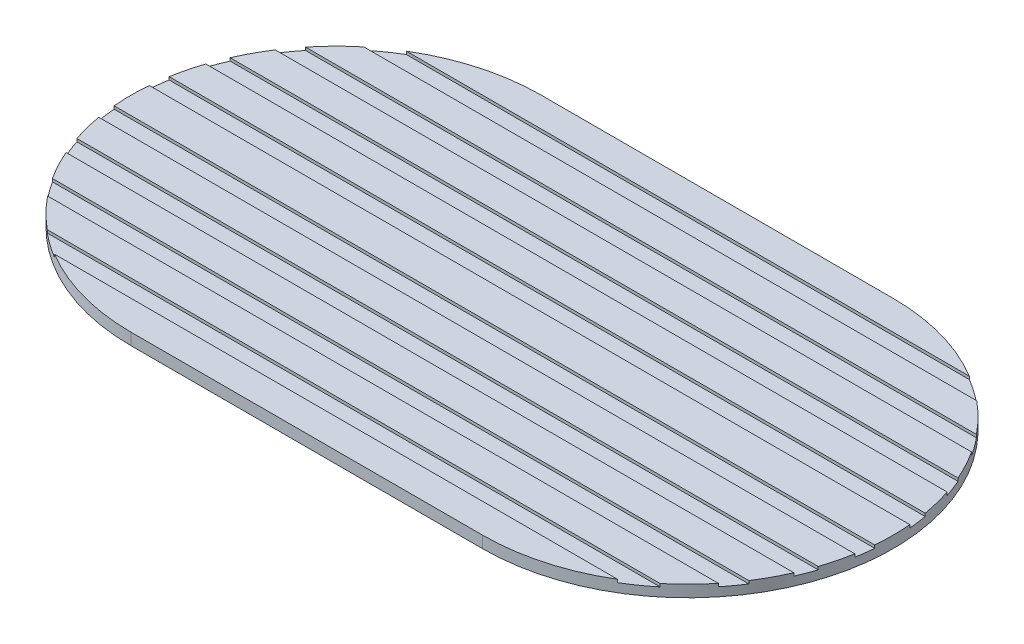
ISO-10303-21;
HEADER;
FILE_DESCRIPTION(('STEP AP214'),'2;1');
FILE_NAME('part.step','',(''),(''),'','','');
FILE_SCHEMA(('AUTOMOTIVE_DESIGN { 1 0 10303 214 1 1 1 1 }'));
ENDSEC;
DATA;
#1=APPLICATION_CONTEXT('core data for automotive mechanical design processes');
#2=APPLICATION_PROTOCOL_DEFINITION('international standard','automotive_design',2000,#1);
#3=PRODUCT_CONTEXT('',#1,'mechanical');
#4=PRODUCT('Part','Part','',(#3));
#5=PRODUCT_RELATED_PRODUCT_CATEGORY('part','',(#4));
#6=PRODUCT_DEFINITION_FORMATION('','',#4);
#7=PRODUCT_DEFINITION_CONTEXT('part definition',#1,'design');
#8=PRODUCT_DEFINITION('design','',#6,#7);
#9=PRODUCT_DEFINITION_SHAPE('','',#8);
#10=(LENGTH_UNIT() NAMED_UNIT(*) SI_UNIT(.MILLI.,.METRE.));
#11=(NAMED_UNIT(*) PLANE_ANGLE_UNIT() SI_UNIT($,.RADIAN.));
#12=(NAMED_UNIT(*) SI_UNIT($,.STERADIAN.) SOLID_ANGLE_UNIT());
#13=UNCERTAINTY_MEASURE_WITH_UNIT(LENGTH_MEASURE(1.E-05),#10,'distance_accuracy_value','');
#14=(GEOMETRIC_REPRESENTATION_CONTEXT(3) GLOBAL_UNCERTAINTY_ASSIGNED_CONTEXT((#13)) GLOBAL_UNIT_ASSIGNED_CONTEXT((#10,
#11,#12)) REPRESENTATION_CONTEXT('',''));
#15=CARTESIAN_POINT('',(0.,0.,0.));
#16=DIRECTION('',(0.,0.,1.));
#17=DIRECTION('',(1.,0.,0.));
#18=AXIS2_PLACEMENT_3D('',#15,#16,#17);
#19=CARTESIAN_POINT('',(0.,2.,0.));
#20=DIRECTION('',(0.,1.,0.));
#21=DIRECTION('',(0.,0.,1.));
#22=AXIS2_PLACEMENT_3D('',#19,#20,#21);
#23=PLANE('',#22);
#24=DIRECTION('',(-1.,0.,0.));
#25=VECTOR('',#24,1.);
#26=CARTESIAN_POINT('',(0.,2.,-30.));
#27=LINE('',#26,#25);
#28=CARTESIAN_POINT('',(18.0277563773199,2.,-30.));
#29=VERTEX_POINT('',#28);
#30=CARTESIAN_POINT('',(-78.02775637732,2.,-30.));
#31=VERTEX_POINT('',#30);
#32=EDGE_CURVE('E353',#29,#31,#27,.T.);
#33=ORIENTED_EDGE('',*,*,#32,.F.);
#34=CARTESIAN_POINT('',(0.,2.,0.));
#35=DIRECTION('',(0.,1.,0.));
#36=DIRECTION('',(0.,0.,1.));
#37=AXIS2_PLACEMENT_3D('',#34,#35,#36);
#38=CIRCLE('',#37,35.);
#39=CARTESIAN_POINT('',(0.,2.,-35.));
#40=VERTEX_POINT('',#39);
#41=EDGE_CURVE('E295',#29,#40,#38,.T.);
#42=ORIENTED_EDGE('',*,*,#41,.T.);
#43=DIRECTION('',(-1.,0.,0.));
#44=VECTOR('',#43,1.);
#45=CARTESIAN_POINT('',(0.,2.,-35.));
#46=LINE('',#45,#44);
#47=CARTESIAN_POINT('',(-60.,2.,-35.));
#48=VERTEX_POINT('',#47);
#49=EDGE_CURVE('E292',#40,#48,#46,.T.);
#50=ORIENTED_EDGE('',*,*,#49,.T.);
#51=CARTESIAN_POINT('',(-60.,2.,0.));
#52=DIRECTION('',(0.,1.,0.));
#53=DIRECTION('',(0.,0.,1.));
#54=AXIS2_PLACEMENT_3D('',#51,#52,#53);
#55=CIRCLE('',#54,35.);
#56=EDGE_CURVE('E444',#48,#31,#55,.T.);
#57=ORIENTED_EDGE('',*,*,#56,.T.);
#58=EDGE_LOOP('',(#33,#42,#50,#57));
#59=FACE_BOUND('',#58,.T.);
#60=ADVANCED_FACE('F35',(#59),#23,.T.);
#61=DIRECTION('',(-1.,0.,0.));
#62=VECTOR('',#61,1.);
#63=CARTESIAN_POINT('',(0.,2.,-14.));
#64=LINE('',#63,#62);
#65=CARTESIAN_POINT('',(32.0780298646909,2.,-14.));
#66=VERTEX_POINT('',#65);
#67=CARTESIAN_POINT('',(-92.0780298646909,2.,-14.));
#68=VERTEX_POINT('',#67);
#69=EDGE_CURVE('E349',#66,#68,#64,.T.);
#70=ORIENTED_EDGE('',*,*,#69,.F.);
#71=CARTESIAN_POINT('',(29.3938769133981,2.,-19.));
#72=VERTEX_POINT('',#71);
#73=EDGE_CURVE('E307',#66,#72,#38,.T.);
#74=ORIENTED_EDGE('',*,*,#73,.T.);
#75=DIRECTION('',(1.,0.,0.));
#76=VECTOR('',#75,1.);
#77=CARTESIAN_POINT('',(0.,2.,-19.));
#78=LINE('',#77,#76);
#79=CARTESIAN_POINT('',(-89.3938769133981,2.,-19.));
#80=VERTEX_POINT('',#79);
#81=EDGE_CURVE('E343',#80,#72,#78,.T.);
#82=ORIENTED_EDGE('',*,*,#81,.F.);
#83=EDGE_CURVE('E449',#80,#68,#55,.T.);
#84=ORIENTED_EDGE('',*,*,#83,.T.);
#85=EDGE_LOOP('',(#70,#74,#82,#84));
#86=FACE_BOUND('',#85,.T.);
#87=ADVANCED_FACE('F481',(#86),#23,.T.);
#88=DIRECTION('',(1.,0.,0.));
#89=VECTOR('',#88,1.);
#90=CARTESIAN_POINT('',(0.,2.,-27.));
#91=LINE('',#90,#89);
#92=CARTESIAN_POINT('',(-82.2710574513201,2.,-27.));
#93=VERTEX_POINT('',#92);
#94=CARTESIAN_POINT('',(22.2710574513201,2.,-27.));
#95=VERTEX_POINT('',#94);
#96=EDGE_CURVE('E351',#93,#95,#91,.T.);
#97=ORIENTED_EDGE('',*,*,#96,.F.);
#98=CARTESIAN_POINT('',(-87.2213151776324,2.,-22.));
#99=VERTEX_POINT('',#98);
#100=EDGE_CURVE('E446',#93,#99,#55,.T.);
#101=ORIENTED_EDGE('',*,*,#100,.T.);
#102=DIRECTION('',(-1.,0.,0.));
#103=VECTOR('',#102,1.);
#104=CARTESIAN_POINT('',(0.,2.,-22.));
#105=LINE('',#104,#103);
#106=CARTESIAN_POINT('',(27.2213151776324,2.,-22.));
#107=VERTEX_POINT('',#106);
#108=EDGE_CURVE('E345',#107,#99,#105,.T.);
#109=ORIENTED_EDGE('',*,*,#108,.F.);
#110=EDGE_CURVE('E301',#107,#95,#38,.T.);
#111=ORIENTED_EDGE('',*,*,#110,.T.);
#112=EDGE_LOOP('',(#97,#101,#109,#111));
#113=FACE_BOUND('',#112,.T.);
#114=ADVANCED_FACE('F555',(#113),#23,.T.);
#115=DIRECTION('',(1.,0.,0.));
#116=VECTOR('',#115,1.);
#117=CARTESIAN_POINT('',(0.,2.,-11.));
#118=LINE('',#117,#116);
#119=CARTESIAN_POINT('',(-93.2264954516723,2.,-11.));
#120=VERTEX_POINT('',#119);
#121=CARTESIAN_POINT('',(33.2264954516723,2.,-11.));
#122=VERTEX_POINT('',#121);
#123=EDGE_CURVE('E347',#120,#122,#118,.T.);
#124=ORIENTED_EDGE('',*,*,#123,.F.);
#125=CARTESIAN_POINT('',(-94.4818792991334,2.,-6.));
#126=VERTEX_POINT('',#125);
#127=EDGE_CURVE('E394',#120,#126,#55,.T.);
#128=ORIENTED_EDGE('',*,*,#127,.T.);
#129=DIRECTION('',(-1.,0.,0.));
#130=VECTOR('',#129,1.);
#131=CARTESIAN_POINT('',(0.,2.,-6.));
#132=LINE('',#131,#130);
#133=CARTESIAN_POINT('',(34.4818792991333,2.,-6.));
#134=VERTEX_POINT('',#133);
#135=EDGE_CURVE('E341',#134,#126,#132,.T.);
#136=ORIENTED_EDGE('',*,*,#135,.F.);
#137=EDGE_CURVE('E492',#134,#122,#38,.T.);
#138=ORIENTED_EDGE('',*,*,#137,.T.);
#139=EDGE_LOOP('',(#124,#128,#136,#138));
#140=FACE_BOUND('',#139,.T.);
#141=ADVANCED_FACE('F663',(#140),#23,.T.);
#142=DIRECTION('',(1.,0.,0.));
#143=VECTOR('',#142,1.);
#144=CARTESIAN_POINT('',(0.,2.,-3.));
#145=LINE('',#144,#143);
#146=CARTESIAN_POINT('',(-94.8711915483254,2.,-3.));
#147=VERTEX_POINT('',#146);
#148=CARTESIAN_POINT('',(34.8711915483254,2.,-3.));
#149=VERTEX_POINT('',#148);
#150=EDGE_CURVE('E339',#147,#149,#145,.T.);
#151=ORIENTED_EDGE('',*,*,#150,.F.);
#152=CARTESIAN_POINT('',(-94.8711915483254,2.,3.));
#153=VERTEX_POINT('',#152);
#154=EDGE_CURVE('E464',#147,#153,#55,.T.);
#155=ORIENTED_EDGE('',*,*,#154,.T.);
#156=DIRECTION('',(-1.,0.,0.));
#157=VECTOR('',#156,1.);
#158=CARTESIAN_POINT('',(0.,2.,3.));
#159=LINE('',#158,#157);
#160=CARTESIAN_POINT('',(34.8711915483254,2.,3.));
#161=VERTEX_POINT('',#160);
#162=EDGE_CURVE('E337',#161,#153,#159,.T.);
#163=ORIENTED_EDGE('',*,*,#162,.F.);
#164=EDGE_CURVE('E494',#161,#149,#38,.T.);
#165=ORIENTED_EDGE('',*,*,#164,.T.);
#166=EDGE_LOOP('',(#151,#155,#163,#165));
#167=FACE_BOUND('',#166,.T.);
#168=ADVANCED_FACE('F659',(#167),#23,.T.);
#169=DIRECTION('',(1.,0.,0.));
#170=VECTOR('',#169,1.);
#171=CARTESIAN_POINT('',(0.,2.,6.));
#172=LINE('',#171,#170);
#173=CARTESIAN_POINT('',(-94.4818792991334,2.,6.));
#174=VERTEX_POINT('',#173);
#175=CARTESIAN_POINT('',(34.4818792991333,2.,6.));
#176=VERTEX_POINT('',#175);
#177=EDGE_CURVE('E335',#174,#176,#172,.T.);
#178=ORIENTED_EDGE('',*,*,#177,.F.);
#179=CARTESIAN_POINT('',(-93.2264954516723,2.,11.));
#180=VERTEX_POINT('',#179);
#181=EDGE_CURVE('E458',#174,#180,#55,.T.);
#182=ORIENTED_EDGE('',*,*,#181,.T.);
#183=DIRECTION('',(-1.,0.,0.));
#184=VECTOR('',#183,1.);
#185=CARTESIAN_POINT('',(0.,2.,11.));
#186=LINE('',#185,#184);
#187=CARTESIAN_POINT('',(33.2264954516723,2.,11.));
#188=VERTEX_POINT('',#187);
#189=EDGE_CURVE('E333',#188,#180,#186,.T.);
#190=ORIENTED_EDGE('',*,*,#189,.F.);
#191=EDGE_CURVE('E497',#188,#176,#38,.T.);
#192=ORIENTED_EDGE('',*,*,#191,.T.);
#193=EDGE_LOOP('',(#178,#182,#190,#192));
#194=FACE_BOUND('',#193,.T.);
#195=ADVANCED_FACE('F655',(#194),#23,.T.);
#196=DIRECTION('',(1.,0.,0.));
#197=VECTOR('',#196,1.);
#198=CARTESIAN_POINT('',(0.,2.,14.));
#199=LINE('',#198,#197);
#200=CARTESIAN_POINT('',(-92.0780298646909,2.,14.));
#201=VERTEX_POINT('',#200);
#202=CARTESIAN_POINT('',(32.0780298646909,2.,14.));
#203=VERTEX_POINT('',#202);
#204=EDGE_CURVE('E331',#201,#203,#199,.T.);
#205=ORIENTED_EDGE('',*,*,#204,.F.);
#206=CARTESIAN_POINT('',(-89.3938769133981,2.,19.));
#207=VERTEX_POINT('',#206);
#208=EDGE_CURVE('E453',#201,#207,#55,.T.);
#209=ORIENTED_EDGE('',*,*,#208,.T.);
#210=DIRECTION('',(-1.,0.,0.));
#211=VECTOR('',#210,1.);
#212=CARTESIAN_POINT('',(0.,2.,19.));
#213=LINE('',#212,#211);
#214=CARTESIAN_POINT('',(29.3938769133981,2.,19.));
#215=VERTEX_POINT('',#214);
#216=EDGE_CURVE('E329',#215,#207,#213,.T.);
#217=ORIENTED_EDGE('',*,*,#216,.F.);
#218=EDGE_CURVE('E299',#215,#203,#38,.T.);
#219=ORIENTED_EDGE('',*,*,#218,.T.);
#220=EDGE_LOOP('',(#205,#209,#217,#219));
#221=FACE_BOUND('',#220,.T.);
#222=ADVANCED_FACE('F503',(#221),#23,.T.);
#223=DIRECTION('',(1.,0.,0.));
#224=VECTOR('',#223,1.);
#225=CARTESIAN_POINT('',(0.,2.,22.));
#226=LINE('',#225,#224);
#227=CARTESIAN_POINT('',(-87.2213151776324,2.,22.));
#228=VERTEX_POINT('',#227);
#229=CARTESIAN_POINT('',(27.2213151776324,2.,22.));
#230=VERTEX_POINT('',#229);
#231=EDGE_CURVE('E327',#228,#230,#226,.T.);
#232=ORIENTED_EDGE('',*,*,#231,.F.);
#233=CARTESIAN_POINT('',(-82.2710574513201,2.,27.));
#234=VERTEX_POINT('',#233);
#235=EDGE_CURVE('E450',#228,#234,#55,.T.);
#236=ORIENTED_EDGE('',*,*,#235,.T.);
#237=DIRECTION('',(-1.,0.,0.));
#238=VECTOR('',#237,1.);
#239=CARTESIAN_POINT('',(0.,2.,27.));
#240=LINE('',#239,#238);
#241=CARTESIAN_POINT('',(22.2710574513201,2.,27.));
#242=VERTEX_POINT('',#241);
#243=EDGE_CURVE('E275',#242,#234,#240,.T.);
#244=ORIENTED_EDGE('',*,*,#243,.F.);
#245=EDGE_CURVE('E293',#242,#230,#38,.T.);
#246=ORIENTED_EDGE('',*,*,#245,.T.);
#247=EDGE_LOOP('',(#232,#236,#244,#246));
#248=FACE_BOUND('',#247,.T.);
#249=ADVANCED_FACE('F616',(#248),#23,.T.);
#250=CARTESIAN_POINT('',(0.,2.,0.));
#251=DIRECTION('',(0.,-1.,0.));
#252=DIRECTION('',(0.,0.,-1.));
#253=AXIS2_PLACEMENT_3D('',#250,#251,#252);
#254=CYLINDRICAL_SURFACE('',#253,35.);
#255=ORIENTED_EDGE('',*,*,#41,.F.);
#256=DIRECTION('',(0.,-1.,0.));
#257=VECTOR('',#256,1.);
#258=CARTESIAN_POINT('',(18.02775637732,2.,-30.));
#259=LINE('',#258,#257);
#260=CARTESIAN_POINT('',(18.02775637732,1.5,-30.));
#261=VERTEX_POINT('',#260);
#262=EDGE_CURVE('E417',#29,#261,#259,.T.);
#263=ORIENTED_EDGE('',*,*,#262,.T.);
#264=CARTESIAN_POINT('',(0.,1.5,0.));
#265=DIRECTION('',(0.,-1.,0.));
#266=DIRECTION('',(0.,0.,-1.));
#267=AXIS2_PLACEMENT_3D('',#264,#265,#266);
#268=CIRCLE('',#267,35.);
#269=CARTESIAN_POINT('',(22.2710574513201,1.5,-27.));
#270=VERTEX_POINT('',#269);
#271=EDGE_CURVE('E435',#261,#270,#268,.T.);
#272=ORIENTED_EDGE('',*,*,#271,.T.);
#273=DIRECTION('',(0.,-1.,0.));
#274=VECTOR('',#273,1.);
#275=CARTESIAN_POINT('',(22.2710574513201,2.,-27.));
#276=LINE('',#275,#274);
#277=EDGE_CURVE('E411',#270,#95,#276,.F.);
#278=ORIENTED_EDGE('',*,*,#277,.T.);
#279=ORIENTED_EDGE('',*,*,#110,.F.);
#280=DIRECTION('',(0.,-1.,0.));
#281=VECTOR('',#280,1.);
#282=CARTESIAN_POINT('',(27.2213151776324,2.,-22.));
#283=LINE('',#282,#281);
#284=CARTESIAN_POINT('',(27.2213151776324,1.5,-22.));
#285=VERTEX_POINT('',#284);
#286=EDGE_CURVE('E395',#107,#285,#283,.T.);
#287=ORIENTED_EDGE('',*,*,#286,.T.);
#288=CARTESIAN_POINT('',(0.,1.5,0.));
#289=DIRECTION('',(0.,1.,0.));
#290=DIRECTION('',(0.,0.,1.));
#291=AXIS2_PLACEMENT_3D('',#288,#289,#290);
#292=CIRCLE('',#291,35.);
#293=CARTESIAN_POINT('',(29.3938769133981,1.5,-19.));
#294=VERTEX_POINT('',#293);
#295=EDGE_CURVE('E432',#294,#285,#292,.T.);
#296=ORIENTED_EDGE('',*,*,#295,.F.);
#297=DIRECTION('',(0.,-1.,0.));
#298=VECTOR('',#297,1.);
#299=CARTESIAN_POINT('',(29.3938769133981,2.,-19.));
#300=LINE('',#299,#298);
#301=EDGE_CURVE('E491',#294,#72,#300,.F.);
#302=ORIENTED_EDGE('',*,*,#301,.T.);
#303=ORIENTED_EDGE('',*,*,#73,.F.);
#304=DIRECTION('',(0.,-1.,0.));
#305=VECTOR('',#304,1.);
#306=CARTESIAN_POINT('',(32.0780298646909,2.,-14.));
#307=LINE('',#306,#305);
#308=CARTESIAN_POINT('',(32.0780298646909,1.5,-14.));
#309=VERTEX_POINT('',#308);
#310=EDGE_CURVE('E405',#66,#309,#307,.T.);
#311=ORIENTED_EDGE('',*,*,#310,.T.);
#312=CARTESIAN_POINT('',(0.,1.5,0.));
#313=DIRECTION('',(0.,1.,0.));
#314=DIRECTION('',(0.,0.,1.));
#315=AXIS2_PLACEMENT_3D('',#312,#313,#314);
#316=CIRCLE('',#315,35.);
#317=CARTESIAN_POINT('',(33.2264954516723,1.5,-11.));
#318=VERTEX_POINT('',#317);
#319=EDGE_CURVE('E434',#318,#309,#316,.T.);
#320=ORIENTED_EDGE('',*,*,#319,.F.);
#321=DIRECTION('',(0.,-1.,0.));
#322=VECTOR('',#321,1.);
#323=CARTESIAN_POINT('',(33.2264954516723,2.,-11.));
#324=LINE('',#323,#322);
#325=EDGE_CURVE('E387',#318,#122,#324,.F.);
#326=ORIENTED_EDGE('',*,*,#325,.T.);
#327=ORIENTED_EDGE('',*,*,#137,.F.);
#328=DIRECTION('',(0.,-1.,0.));
#329=VECTOR('',#328,1.);
#330=CARTESIAN_POINT('',(34.4818792991333,2.,-6.));
#331=LINE('',#330,#329);
#332=CARTESIAN_POINT('',(34.4818792991333,1.5,-6.));
#333=VERTEX_POINT('',#332);
#334=EDGE_CURVE('E543',#134,#333,#331,.T.);
#335=ORIENTED_EDGE('',*,*,#334,.T.);
#336=CARTESIAN_POINT('',(0.,1.5,0.));
#337=DIRECTION('',(0.,1.,0.));
#338=DIRECTION('',(0.,0.,1.));
#339=AXIS2_PLACEMENT_3D('',#336,#337,#338);
#340=CIRCLE('',#339,35.);
#341=CARTESIAN_POINT('',(34.8711915483254,1.5,-3.));
#342=VERTEX_POINT('',#341);
#343=EDGE_CURVE('E430',#342,#333,#340,.T.);
#344=ORIENTED_EDGE('',*,*,#343,.F.);
#345=DIRECTION('',(0.,-1.,0.));
#346=VECTOR('',#345,1.);
#347=CARTESIAN_POINT('',(34.8711915483254,2.,-3.));
#348=LINE('',#347,#346);
#349=EDGE_CURVE('E538',#342,#149,#348,.F.);
#350=ORIENTED_EDGE('',*,*,#349,.T.);
#351=ORIENTED_EDGE('',*,*,#164,.F.);
#352=DIRECTION('',(0.,-1.,0.));
#353=VECTOR('',#352,1.);
#354=CARTESIAN_POINT('',(34.8711915483254,2.,3.));
#355=LINE('',#354,#353);
#356=CARTESIAN_POINT('',(34.8711915483254,1.5,3.));
#357=VERTEX_POINT('',#356);
#358=EDGE_CURVE('E532',#161,#357,#355,.T.);
#359=ORIENTED_EDGE('',*,*,#358,.T.);
#360=CARTESIAN_POINT('',(0.,1.5,0.));
#361=DIRECTION('',(0.,-1.,0.));
#362=DIRECTION('',(0.,0.,-1.));
#363=AXIS2_PLACEMENT_3D('',#360,#361,#362);
#364=CIRCLE('',#363,35.);
#365=CARTESIAN_POINT('',(34.4818792991333,1.5,6.));
#366=VERTEX_POINT('',#365);
#367=EDGE_CURVE('E427',#357,#366,#364,.T.);
#368=ORIENTED_EDGE('',*,*,#367,.T.);
#369=DIRECTION('',(0.,-1.,0.));
#370=VECTOR('',#369,1.);
#371=CARTESIAN_POINT('',(34.4818792991333,2.,6.));
#372=LINE('',#371,#370);
#373=EDGE_CURVE('E526',#366,#176,#372,.F.);
#374=ORIENTED_EDGE('',*,*,#373,.T.);
#375=ORIENTED_EDGE('',*,*,#191,.F.);
#376=DIRECTION('',(0.,-1.,0.));
#377=VECTOR('',#376,1.);
#378=CARTESIAN_POINT('',(33.2264954516723,2.,11.));
#379=LINE('',#378,#377);
#380=CARTESIAN_POINT('',(33.2264954516723,1.5,11.));
#381=VERTEX_POINT('',#380);
#382=EDGE_CURVE('E516',#188,#381,#379,.T.);
#383=ORIENTED_EDGE('',*,*,#382,.T.);
#384=CARTESIAN_POINT('',(0.,1.5,0.));
#385=DIRECTION('',(0.,-1.,0.));
#386=DIRECTION('',(0.,0.,-1.));
#387=AXIS2_PLACEMENT_3D('',#384,#385,#386);
#388=CIRCLE('',#387,35.);
#389=CARTESIAN_POINT('',(32.0780298646909,1.5,14.));
#390=VERTEX_POINT('',#389);
#391=EDGE_CURVE('E424',#381,#390,#388,.T.);
#392=ORIENTED_EDGE('',*,*,#391,.T.);
#393=DIRECTION('',(0.,-1.,0.));
#394=VECTOR('',#393,1.);
#395=CARTESIAN_POINT('',(32.0780298646909,2.,14.));
#396=LINE('',#395,#394);
#397=EDGE_CURVE('E507',#390,#203,#396,.F.);
#398=ORIENTED_EDGE('',*,*,#397,.T.);
#399=ORIENTED_EDGE('',*,*,#218,.F.);
#400=DIRECTION('',(0.,-1.,0.));
#401=VECTOR('',#400,1.);
#402=CARTESIAN_POINT('',(29.3938769133981,2.,19.));
#403=LINE('',#402,#401);
#404=CARTESIAN_POINT('',(29.3938769133981,1.5,19.));
#405=VERTEX_POINT('',#404);
#406=EDGE_CURVE('E506',#215,#405,#403,.T.);
#407=ORIENTED_EDGE('',*,*,#406,.T.);
#408=CARTESIAN_POINT('',(0.,1.5,0.));
#409=DIRECTION('',(0.,-1.,0.));
#410=DIRECTION('',(0.,0.,-1.));
#411=AXIS2_PLACEMENT_3D('',#408,#409,#410);
#412=CIRCLE('',#411,35.);
#413=CARTESIAN_POINT('',(27.2213151776324,1.5,22.));
#414=VERTEX_POINT('',#413);
#415=EDGE_CURVE('E421',#405,#414,#412,.T.);
#416=ORIENTED_EDGE('',*,*,#415,.T.);
#417=DIRECTION('',(0.,-1.,0.));
#418=VECTOR('',#417,1.);
#419=CARTESIAN_POINT('',(27.2213151776324,2.,22.));
#420=LINE('',#419,#418);
#421=EDGE_CURVE('E605',#414,#230,#420,.F.);
#422=ORIENTED_EDGE('',*,*,#421,.T.);
#423=ORIENTED_EDGE('',*,*,#245,.F.);
#424=DIRECTION('',(0.,-1.,0.));
#425=VECTOR('',#424,1.);
#426=CARTESIAN_POINT('',(22.2710574513201,2.,27.));
#427=LINE('',#426,#425);
#428=CARTESIAN_POINT('',(22.2710574513201,1.5,27.));
#429=VERTEX_POINT('',#428);
#430=EDGE_CURVE('E602',#242,#429,#427,.T.);
#431=ORIENTED_EDGE('',*,*,#430,.T.);
#432=CARTESIAN_POINT('',(0.,1.5,0.));
#433=DIRECTION('',(0.,1.,0.));
#434=DIRECTION('',(0.,0.,1.));
#435=AXIS2_PLACEMENT_3D('',#432,#433,#434);
#436=CIRCLE('',#435,35.);
#437=CARTESIAN_POINT('',(18.02775637732,1.5,30.));
#438=VERTEX_POINT('',#437);
#439=EDGE_CURVE('E285',#438,#429,#436,.T.);
#440=ORIENTED_EDGE('',*,*,#439,.F.);
#441=DIRECTION('',(0.,-1.,0.));
#442=VECTOR('',#441,1.);
#443=CARTESIAN_POINT('',(18.02775637732,2.,30.));
#444=LINE('',#443,#442);
#445=CARTESIAN_POINT('',(18.0277563773199,2.,30.));
#446=VERTEX_POINT('',#445);
#447=EDGE_CURVE('E270',#438,#446,#444,.F.);
#448=ORIENTED_EDGE('',*,*,#447,.T.);
#449=CARTESIAN_POINT('',(0.,2.,35.));
#450=VERTEX_POINT('',#449);
#451=EDGE_CURVE('E283',#450,#446,#38,.T.);
#452=ORIENTED_EDGE('',*,*,#451,.F.);
#453=DIRECTION('',(0.,-1.,0.));
#454=VECTOR('',#453,1.);
#455=CARTESIAN_POINT('',(0.,2.,35.));
#456=LINE('',#455,#454);
#457=CARTESIAN_POINT('',(0.,0.,35.));
#458=VERTEX_POINT('',#457);
#459=EDGE_CURVE('E317',#450,#458,#456,.T.);
#460=ORIENTED_EDGE('',*,*,#459,.T.);
#461=CARTESIAN_POINT('',(0.,0.,0.));
#462=DIRECTION('',(0.,1.,0.));
#463=DIRECTION('',(0.,0.,1.));
#464=AXIS2_PLACEMENT_3D('',#461,#462,#463);
#465=CIRCLE('',#464,35.);
#466=CARTESIAN_POINT('',(0.,0.,-35.));
#467=VERTEX_POINT('',#466);
#468=EDGE_CURVE('E437',#458,#467,#465,.T.);
#469=ORIENTED_EDGE('',*,*,#468,.T.);
#470=DIRECTION('',(0.,-1.,0.));
#471=VECTOR('',#470,1.);
#472=CARTESIAN_POINT('',(0.,2.,-35.));
#473=LINE('',#472,#471);
#474=EDGE_CURVE('E276',#40,#467,#473,.T.);
#475=ORIENTED_EDGE('',*,*,#474,.F.);
#476=EDGE_LOOP('',(#255,#263,#272,#278,#279,#287,#296,#302,#303,#311,#320,#326,#327,#335,#344,
#350,#351,#359,#368,#374,#375,#383,#392,#398,#399,#407,#416,#422,#423,#431,#440,#448,#452,#460,
#469,#475));
#477=FACE_BOUND('',#476,.T.);
#478=ADVANCED_FACE('F37',(#477),#254,.T.);
#479=CARTESIAN_POINT('',(0.,2.,-35.));
#480=DIRECTION('',(0.,0.,1.));
#481=DIRECTION('',(1.,0.,0.));
#482=AXIS2_PLACEMENT_3D('',#479,#480,#481);
#483=PLANE('',#482);
#484=DIRECTION('',(-1.,0.,0.));
#485=VECTOR('',#484,1.);
#486=CARTESIAN_POINT('',(0.,0.,-35.));
#487=LINE('',#486,#485);
#488=CARTESIAN_POINT('',(-60.,0.,-35.));
#489=VERTEX_POINT('',#488);
#490=EDGE_CURVE('E313',#467,#489,#487,.T.);
#491=ORIENTED_EDGE('',*,*,#490,.T.);
#492=DIRECTION('',(0.,-1.,0.));
#493=VECTOR('',#492,1.);
#494=CARTESIAN_POINT('',(-60.,2.,-35.));
#495=LINE('',#494,#493);
#496=EDGE_CURVE('E321',#48,#489,#495,.T.);
#497=ORIENTED_EDGE('',*,*,#496,.F.);
#498=ORIENTED_EDGE('',*,*,#49,.F.);
#499=ORIENTED_EDGE('',*,*,#474,.T.);
#500=EDGE_LOOP('',(#491,#497,#498,#499));
#501=FACE_BOUND('',#500,.T.);
#502=ADVANCED_FACE('F654',(#501),#483,.F.);
#503=CARTESIAN_POINT('',(-60.,2.,0.));
#504=DIRECTION('',(0.,-1.,0.));
#505=DIRECTION('',(0.,0.,-1.));
#506=AXIS2_PLACEMENT_3D('',#503,#504,#505);
#507=CYLINDRICAL_SURFACE('',#506,35.);
#508=CARTESIAN_POINT('',(-60.,1.5,0.));
#509=DIRECTION('',(0.,-1.,0.));
#510=DIRECTION('',(0.,0.,-1.));
#511=AXIS2_PLACEMENT_3D('',#508,#509,#510);
#512=CIRCLE('',#511,35.);
#513=CARTESIAN_POINT('',(-82.2710574513201,1.5,-27.));
#514=VERTEX_POINT('',#513);
#515=CARTESIAN_POINT('',(-78.02775637732,1.5,-30.));
#516=VERTEX_POINT('',#515);
#517=EDGE_CURVE('E11',#514,#516,#512,.T.);
#518=ORIENTED_EDGE('',*,*,#517,.T.);
#519=DIRECTION('',(0.,-1.,0.));
#520=VECTOR('',#519,1.);
#521=CARTESIAN_POINT('',(-78.02775637732,2.,-30.));
#522=LINE('',#521,#520);
#523=EDGE_CURVE('E414',#516,#31,#522,.F.);
#524=ORIENTED_EDGE('',*,*,#523,.T.);
#525=ORIENTED_EDGE('',*,*,#56,.F.);
#526=ORIENTED_EDGE('',*,*,#496,.T.);
#527=CARTESIAN_POINT('',(-60.,0.,0.));
#528=DIRECTION('',(0.,1.,0.));
#529=DIRECTION('',(0.,0.,1.));
#530=AXIS2_PLACEMENT_3D('',#527,#528,#529);
#531=CIRCLE('',#530,35.);
#532=CARTESIAN_POINT('',(-60.,0.,35.));
#533=VERTEX_POINT('',#532);
#534=EDGE_CURVE('E308',#489,#533,#531,.T.);
#535=ORIENTED_EDGE('',*,*,#534,.T.);
#536=DIRECTION('',(0.,-1.,0.));
#537=VECTOR('',#536,1.);
#538=CARTESIAN_POINT('',(-60.,2.,35.));
#539=LINE('',#538,#537);
#540=CARTESIAN_POINT('',(-60.,2.,35.));
#541=VERTEX_POINT('',#540);
#542=EDGE_CURVE('E319',#541,#533,#539,.T.);
#543=ORIENTED_EDGE('',*,*,#542,.F.);
#544=CARTESIAN_POINT('',(-78.02775637732,2.,30.));
#545=VERTEX_POINT('',#544);
#546=EDGE_CURVE('E296',#545,#541,#55,.T.);
#547=ORIENTED_EDGE('',*,*,#546,.F.);
#548=DIRECTION('',(0.,-1.,0.));
#549=VECTOR('',#548,1.);
#550=CARTESIAN_POINT('',(-78.02775637732,2.,30.));
#551=LINE('',#550,#549);
#552=CARTESIAN_POINT('',(-78.02775637732,1.5,30.));
#553=VERTEX_POINT('',#552);
#554=EDGE_CURVE('E50',#545,#553,#551,.T.);
#555=ORIENTED_EDGE('',*,*,#554,.T.);
#556=CARTESIAN_POINT('',(-60.,1.5,0.));
#557=DIRECTION('',(0.,1.,0.));
#558=DIRECTION('',(0.,0.,1.));
#559=AXIS2_PLACEMENT_3D('',#556,#557,#558);
#560=CIRCLE('',#559,35.);
#561=CARTESIAN_POINT('',(-82.2710574513201,1.5,27.));
#562=VERTEX_POINT('',#561);
#563=EDGE_CURVE('E355',#562,#553,#560,.T.);
#564=ORIENTED_EDGE('',*,*,#563,.F.);
#565=DIRECTION('',(0.,-1.,0.));
#566=VECTOR('',#565,1.);
#567=CARTESIAN_POINT('',(-82.2710574513201,2.,27.));
#568=LINE('',#567,#566);
#569=EDGE_CURVE('E286',#562,#234,#568,.F.);
#570=ORIENTED_EDGE('',*,*,#569,.T.);
#571=ORIENTED_EDGE('',*,*,#235,.F.);
#572=DIRECTION('',(0.,-1.,0.));
#573=VECTOR('',#572,1.);
#574=CARTESIAN_POINT('',(-87.2213151776324,2.,22.));
#575=LINE('',#574,#573);
#576=CARTESIAN_POINT('',(-87.2213151776324,1.5,22.));
#577=VERTEX_POINT('',#576);
#578=EDGE_CURVE('E58',#228,#577,#575,.T.);
#579=ORIENTED_EDGE('',*,*,#578,.T.);
#580=CARTESIAN_POINT('',(-60.,1.5,0.));
#581=DIRECTION('',(0.,-1.,0.));
#582=DIRECTION('',(0.,0.,-1.));
#583=AXIS2_PLACEMENT_3D('',#580,#581,#582);
#584=CIRCLE('',#583,35.);
#585=CARTESIAN_POINT('',(-89.3938769133981,1.5,19.));
#586=VERTEX_POINT('',#585);
#587=EDGE_CURVE('E357',#577,#586,#584,.T.);
#588=ORIENTED_EDGE('',*,*,#587,.T.);
#589=DIRECTION('',(0.,-1.,0.));
#590=VECTOR('',#589,1.);
#591=CARTESIAN_POINT('',(-89.3938769133981,2.,19.));
#592=LINE('',#591,#590);
#593=EDGE_CURVE('E608',#586,#207,#592,.F.);
#594=ORIENTED_EDGE('',*,*,#593,.T.);
#595=ORIENTED_EDGE('',*,*,#208,.F.);
#596=DIRECTION('',(0.,-1.,0.));
#597=VECTOR('',#596,1.);
#598=CARTESIAN_POINT('',(-92.0780298646909,2.,14.));
#599=LINE('',#598,#597);
#600=CARTESIAN_POINT('',(-92.0780298646909,1.5,14.));
#601=VERTEX_POINT('',#600);
#602=EDGE_CURVE('E513',#201,#601,#599,.T.);
#603=ORIENTED_EDGE('',*,*,#602,.T.);
#604=CARTESIAN_POINT('',(-60.,1.5,0.));
#605=DIRECTION('',(0.,-1.,0.));
#606=DIRECTION('',(0.,0.,-1.));
#607=AXIS2_PLACEMENT_3D('',#604,#605,#606);
#608=CIRCLE('',#607,35.);
#609=CARTESIAN_POINT('',(-93.2264954516723,1.5,11.));
#610=VERTEX_POINT('',#609);
#611=EDGE_CURVE('E360',#601,#610,#608,.T.);
#612=ORIENTED_EDGE('',*,*,#611,.T.);
#613=DIRECTION('',(0.,-1.,0.));
#614=VECTOR('',#613,1.);
#615=CARTESIAN_POINT('',(-93.2264954516723,2.,11.));
#616=LINE('',#615,#614);
#617=EDGE_CURVE('E512',#610,#180,#616,.F.);
#618=ORIENTED_EDGE('',*,*,#617,.T.);
#619=ORIENTED_EDGE('',*,*,#181,.F.);
#620=DIRECTION('',(0.,-1.,0.));
#621=VECTOR('',#620,1.);
#622=CARTESIAN_POINT('',(-94.4818792991334,2.,6.));
#623=LINE('',#622,#621);
#624=CARTESIAN_POINT('',(-94.4818792991334,1.5,6.));
#625=VERTEX_POINT('',#624);
#626=EDGE_CURVE('E523',#174,#625,#623,.T.);
#627=ORIENTED_EDGE('',*,*,#626,.T.);
#628=CARTESIAN_POINT('',(-60.,1.5,0.));
#629=DIRECTION('',(0.,-1.,0.));
#630=DIRECTION('',(0.,0.,-1.));
#631=AXIS2_PLACEMENT_3D('',#628,#629,#630);
#632=CIRCLE('',#631,35.);
#633=CARTESIAN_POINT('',(-94.8711915483254,1.5,3.));
#634=VERTEX_POINT('',#633);
#635=EDGE_CURVE('E363',#625,#634,#632,.T.);
#636=ORIENTED_EDGE('',*,*,#635,.T.);
#637=DIRECTION('',(0.,-1.,0.));
#638=VECTOR('',#637,1.);
#639=CARTESIAN_POINT('',(-94.8711915483254,2.,3.));
#640=LINE('',#639,#638);
#641=EDGE_CURVE('E529',#634,#153,#640,.F.);
#642=ORIENTED_EDGE('',*,*,#641,.T.);
#643=ORIENTED_EDGE('',*,*,#154,.F.);
#644=DIRECTION('',(0.,-1.,0.));
#645=VECTOR('',#644,1.);
#646=CARTESIAN_POINT('',(-94.8711915483254,2.,-3.));
#647=LINE('',#646,#645);
#648=CARTESIAN_POINT('',(-94.8711915483254,1.5,-3.));
#649=VERTEX_POINT('',#648);
#650=EDGE_CURVE('E535',#147,#649,#647,.T.);
#651=ORIENTED_EDGE('',*,*,#650,.T.);
#652=CARTESIAN_POINT('',(-60.,1.5,0.));
#653=DIRECTION('',(0.,1.,0.));
#654=DIRECTION('',(0.,0.,1.));
#655=AXIS2_PLACEMENT_3D('',#652,#653,#654);
#656=CIRCLE('',#655,35.);
#657=CARTESIAN_POINT('',(-94.4818792991334,1.5,-6.));
#658=VERTEX_POINT('',#657);
#659=EDGE_CURVE('E366',#658,#649,#656,.T.);
#660=ORIENTED_EDGE('',*,*,#659,.F.);
#661=DIRECTION('',(0.,-1.,0.));
#662=VECTOR('',#661,1.);
#663=CARTESIAN_POINT('',(-94.4818792991334,2.,-6.));
#664=LINE('',#663,#662);
#665=EDGE_CURVE('E541',#658,#126,#664,.F.);
#666=ORIENTED_EDGE('',*,*,#665,.T.);
#667=ORIENTED_EDGE('',*,*,#127,.F.);
#668=DIRECTION('',(0.,-1.,0.));
#669=VECTOR('',#668,1.);
#670=CARTESIAN_POINT('',(-93.2264954516723,2.,-11.));
#671=LINE('',#670,#669);
#672=CARTESIAN_POINT('',(-93.2264954516723,1.5,-11.));
#673=VERTEX_POINT('',#672);
#674=EDGE_CURVE('E384',#120,#673,#671,.T.);
#675=ORIENTED_EDGE('',*,*,#674,.T.);
#676=CARTESIAN_POINT('',(-60.,1.5,0.));
#677=DIRECTION('',(0.,1.,0.));
#678=DIRECTION('',(0.,0.,1.));
#679=AXIS2_PLACEMENT_3D('',#676,#677,#678);
#680=CIRCLE('',#679,35.);
#681=CARTESIAN_POINT('',(-92.0780298646909,1.5,-14.));
#682=VERTEX_POINT('',#681);
#683=EDGE_CURVE('E43',#682,#673,#680,.T.);
#684=ORIENTED_EDGE('',*,*,#683,.F.);
#685=DIRECTION('',(0.,-1.,0.));
#686=VECTOR('',#685,1.);
#687=CARTESIAN_POINT('',(-92.0780298646909,2.,-14.));
#688=LINE('',#687,#686);
#689=EDGE_CURVE('E397',#682,#68,#688,.F.);
#690=ORIENTED_EDGE('',*,*,#689,.T.);
#691=ORIENTED_EDGE('',*,*,#83,.F.);
#692=DIRECTION('',(0.,-1.,0.));
#693=VECTOR('',#692,1.);
#694=CARTESIAN_POINT('',(-89.3938769133981,2.,-19.));
#695=LINE('',#694,#693);
#696=CARTESIAN_POINT('',(-89.3938769133981,1.5,-19.));
#697=VERTEX_POINT('',#696);
#698=EDGE_CURVE('E486',#80,#697,#695,.T.);
#699=ORIENTED_EDGE('',*,*,#698,.T.);
#700=CARTESIAN_POINT('',(-60.,1.5,0.));
#701=DIRECTION('',(0.,1.,0.));
#702=DIRECTION('',(0.,0.,1.));
#703=AXIS2_PLACEMENT_3D('',#700,#701,#702);
#704=CIRCLE('',#703,35.);
#705=CARTESIAN_POINT('',(-87.2213151776324,1.5,-22.));
#706=VERTEX_POINT('',#705);
#707=EDGE_CURVE('E368',#706,#697,#704,.T.);
#708=ORIENTED_EDGE('',*,*,#707,.F.);
#709=DIRECTION('',(0.,-1.,0.));
#710=VECTOR('',#709,1.);
#711=CARTESIAN_POINT('',(-87.2213151776324,2.,-22.));
#712=LINE('',#711,#710);
#713=EDGE_CURVE('E400',#706,#99,#712,.F.);
#714=ORIENTED_EDGE('',*,*,#713,.T.);
#715=ORIENTED_EDGE('',*,*,#100,.F.);
#716=DIRECTION('',(0.,-1.,0.));
#717=VECTOR('',#716,1.);
#718=CARTESIAN_POINT('',(-82.2710574513201,2.,-27.));
#719=LINE('',#718,#717);
#720=EDGE_CURVE('E408',#93,#514,#719,.T.);
#721=ORIENTED_EDGE('',*,*,#720,.T.);
#722=EDGE_LOOP('',(#518,#524,#525,#526,#535,#543,#547,#555,#564,#570,#571,#579,#588,#594,#595,
#603,#612,#618,#619,#627,#636,#642,#643,#651,#660,#666,#667,#675,#684,#690,#691,#699,#708,#714,
#715,#721));
#723=FACE_BOUND('',#722,.T.);
#724=ADVANCED_FACE('F391',(#723),#507,.T.);
#725=CARTESIAN_POINT('',(0.,2.,35.));
#726=DIRECTION('',(0.,0.,-1.));
#727=DIRECTION('',(-1.,0.,0.));
#728=AXIS2_PLACEMENT_3D('',#725,#726,#727);
#729=PLANE('',#728);
#730=DIRECTION('',(1.,0.,0.));
#731=VECTOR('',#730,1.);
#732=CARTESIAN_POINT('',(0.,0.,35.));
#733=LINE('',#732,#731);
#734=EDGE_CURVE('E302',#533,#458,#733,.T.);
#735=ORIENTED_EDGE('',*,*,#734,.T.);
#736=ORIENTED_EDGE('',*,*,#459,.F.);
#737=DIRECTION('',(1.,0.,0.));
#738=VECTOR('',#737,1.);
#739=CARTESIAN_POINT('',(0.,2.,35.));
#740=LINE('',#739,#738);
#741=EDGE_CURVE('E290',#541,#450,#740,.T.);
#742=ORIENTED_EDGE('',*,*,#741,.F.);
#743=ORIENTED_EDGE('',*,*,#542,.T.);
#744=EDGE_LOOP('',(#735,#736,#742,#743));
#745=FACE_BOUND('',#744,.T.);
#746=ADVANCED_FACE('F643',(#745),#729,.F.);
#747=DIRECTION('',(1.,0.,0.));
#748=VECTOR('',#747,1.);
#749=CARTESIAN_POINT('',(0.,2.,30.));
#750=LINE('',#749,#748);
#751=EDGE_CURVE('E267',#545,#446,#750,.T.);
#752=ORIENTED_EDGE('',*,*,#751,.F.);
#753=ORIENTED_EDGE('',*,*,#546,.T.);
#754=ORIENTED_EDGE('',*,*,#741,.T.);
#755=ORIENTED_EDGE('',*,*,#451,.T.);
#756=EDGE_LOOP('',(#752,#753,#754,#755));
#757=FACE_BOUND('',#756,.T.);
#758=ADVANCED_FACE('F288',(#757),#23,.T.);
#759=CARTESIAN_POINT('',(0.,0.,0.));
#760=DIRECTION('',(0.,1.,0.));
#761=DIRECTION('',(0.,0.,1.));
#762=AXIS2_PLACEMENT_3D('',#759,#760,#761);
#763=PLANE('',#762);
#764=ORIENTED_EDGE('',*,*,#468,.F.);
#765=ORIENTED_EDGE('',*,*,#734,.F.);
#766=ORIENTED_EDGE('',*,*,#534,.F.);
#767=ORIENTED_EDGE('',*,*,#490,.F.);
#768=EDGE_LOOP('',(#764,#765,#766,#767));
#769=FACE_BOUND('',#768,.T.);
#770=ADVANCED_FACE('F624',(#769),#763,.F.);
#771=CARTESIAN_POINT('',(0.,1.5,0.));
#772=DIRECTION('',(0.,1.,0.));
#773=DIRECTION('',(0.,0.,1.));
#774=AXIS2_PLACEMENT_3D('',#771,#772,#773);
#775=PLANE('',#774);
#776=ORIENTED_EDGE('',*,*,#439,.T.);
#777=DIRECTION('',(-1.,0.,0.));
#778=VECTOR('',#777,1.);
#779=CARTESIAN_POINT('',(25.1296748624601,1.5,27.));
#780=LINE('',#779,#778);
#781=EDGE_CURVE('E591',#429,#562,#780,.T.);
#782=ORIENTED_EDGE('',*,*,#781,.T.);
#783=ORIENTED_EDGE('',*,*,#563,.T.);
#784=DIRECTION('',(1.,0.,0.));
#785=VECTOR('',#784,1.);
#786=CARTESIAN_POINT('',(-85.8019879705388,1.5,30.));
#787=LINE('',#786,#785);
#788=EDGE_CURVE('E594',#553,#438,#787,.T.);
#789=ORIENTED_EDGE('',*,*,#788,.T.);
#790=EDGE_LOOP('',(#776,#782,#783,#789));
#791=FACE_BOUND('',#790,.T.);
#792=ADVANCED_FACE('F622',(#791),#775,.T.);
#793=CARTESIAN_POINT('',(25.1296748624601,1.5,27.));
#794=DIRECTION('',(0.,0.,-1.));
#795=DIRECTION('',(-1.,0.,0.));
#796=AXIS2_PLACEMENT_3D('',#793,#794,#795);
#797=PLANE('',#796);
#798=ORIENTED_EDGE('',*,*,#243,.T.);
#799=ORIENTED_EDGE('',*,*,#569,.F.);
#800=ORIENTED_EDGE('',*,*,#781,.F.);
#801=ORIENTED_EDGE('',*,*,#430,.F.);
#802=EDGE_LOOP('',(#798,#799,#800,#801));
#803=FACE_BOUND('',#802,.T.);
#804=ADVANCED_FACE('F618',(#803),#797,.F.);
#805=CARTESIAN_POINT('',(-85.8019879705388,1.5,30.));
#806=DIRECTION('',(0.,0.,1.));
#807=DIRECTION('',(1.,0.,0.));
#808=AXIS2_PLACEMENT_3D('',#805,#806,#807);
#809=PLANE('',#808);
#810=ORIENTED_EDGE('',*,*,#788,.F.);
#811=ORIENTED_EDGE('',*,*,#554,.F.);
#812=ORIENTED_EDGE('',*,*,#751,.T.);
#813=ORIENTED_EDGE('',*,*,#447,.F.);
#814=EDGE_LOOP('',(#810,#811,#812,#813));
#815=FACE_BOUND('',#814,.T.);
#816=ADVANCED_FACE('F269',(#815),#809,.F.);
#817=CARTESIAN_POINT('',(0.,1.5,0.));
#818=DIRECTION('',(0.,-1.,0.));
#819=DIRECTION('',(0.,0.,-1.));
#820=AXIS2_PLACEMENT_3D('',#817,#818,#819);
#821=PLANE('',#820);
#822=DIRECTION('',(-1.,0.,0.));
#823=VECTOR('',#822,1.);
#824=CARTESIAN_POINT('',(-92.2561938080951,1.5,19.));
#825=LINE('',#824,#823);
#826=EDGE_CURVE('E588',#405,#586,#825,.T.);
#827=ORIENTED_EDGE('',*,*,#826,.T.);
#828=ORIENTED_EDGE('',*,*,#587,.F.);
#829=DIRECTION('',(1.,0.,0.));
#830=VECTOR('',#829,1.);
#831=CARTESIAN_POINT('',(32.2561938080951,1.5,22.));
#832=LINE('',#831,#830);
#833=EDGE_CURVE('E586',#577,#414,#832,.T.);
#834=ORIENTED_EDGE('',*,*,#833,.T.);
#835=ORIENTED_EDGE('',*,*,#415,.F.);
#836=EDGE_LOOP('',(#827,#828,#834,#835));
#837=FACE_BOUND('',#836,.T.);
#838=ADVANCED_FACE('F614',(#837),#821,.F.);
#839=CARTESIAN_POINT('',(-92.2561938080951,1.5,19.));
#840=DIRECTION('',(0.,0.,-1.));
#841=DIRECTION('',(-1.,0.,0.));
#842=AXIS2_PLACEMENT_3D('',#839,#840,#841);
#843=PLANE('',#842);
#844=ORIENTED_EDGE('',*,*,#216,.T.);
#845=ORIENTED_EDGE('',*,*,#593,.F.);
#846=ORIENTED_EDGE('',*,*,#826,.F.);
#847=ORIENTED_EDGE('',*,*,#406,.F.);
#848=EDGE_LOOP('',(#844,#845,#846,#847));
#849=FACE_BOUND('',#848,.T.);
#850=ADVANCED_FACE('F612',(#849),#843,.F.);
#851=CARTESIAN_POINT('',(32.2561938080951,1.5,22.));
#852=DIRECTION('',(0.,0.,1.));
#853=DIRECTION('',(1.,0.,0.));
#854=AXIS2_PLACEMENT_3D('',#851,#852,#853);
#855=PLANE('',#854);
#856=ORIENTED_EDGE('',*,*,#833,.F.);
#857=ORIENTED_EDGE('',*,*,#578,.F.);
#858=ORIENTED_EDGE('',*,*,#231,.T.);
#859=ORIENTED_EDGE('',*,*,#421,.F.);
#860=EDGE_LOOP('',(#856,#857,#858,#859));
#861=FACE_BOUND('',#860,.T.);
#862=ADVANCED_FACE('F687',(#861),#855,.F.);
#863=CARTESIAN_POINT('',(0.,1.5,0.));
#864=DIRECTION('',(0.,-1.,0.));
#865=DIRECTION('',(0.,0.,-1.));
#866=AXIS2_PLACEMENT_3D('',#863,#864,#865);
#867=PLANE('',#866);
#868=DIRECTION('',(-1.,0.,0.));
#869=VECTOR('',#868,1.);
#870=CARTESIAN_POINT('',(-95.6177593484891,1.5,11.));
#871=LINE('',#870,#869);
#872=EDGE_CURVE('E583',#381,#610,#871,.T.);
#873=ORIENTED_EDGE('',*,*,#872,.T.);
#874=ORIENTED_EDGE('',*,*,#611,.F.);
#875=DIRECTION('',(1.,0.,0.));
#876=VECTOR('',#875,1.);
#877=CARTESIAN_POINT('',(35.8866845917206,1.5,14.));
#878=LINE('',#877,#876);
#879=EDGE_CURVE('E580',#601,#390,#878,.T.);
#880=ORIENTED_EDGE('',*,*,#879,.T.);
#881=ORIENTED_EDGE('',*,*,#391,.F.);
#882=EDGE_LOOP('',(#873,#874,#880,#881));
#883=FACE_BOUND('',#882,.T.);
#884=ADVANCED_FACE('F669',(#883),#867,.F.);
#885=CARTESIAN_POINT('',(-95.6177593484891,1.5,11.));
#886=DIRECTION('',(0.,0.,-1.));
#887=DIRECTION('',(-1.,0.,0.));
#888=AXIS2_PLACEMENT_3D('',#885,#886,#887);
#889=PLANE('',#888);
#890=ORIENTED_EDGE('',*,*,#189,.T.);
#891=ORIENTED_EDGE('',*,*,#617,.F.);
#892=ORIENTED_EDGE('',*,*,#872,.F.);
#893=ORIENTED_EDGE('',*,*,#382,.F.);
#894=EDGE_LOOP('',(#890,#891,#892,#893));
#895=FACE_BOUND('',#894,.T.);
#896=ADVANCED_FACE('F667',(#895),#889,.F.);
#897=CARTESIAN_POINT('',(35.8866845917206,1.5,14.));
#898=DIRECTION('',(0.,0.,1.));
#899=DIRECTION('',(1.,0.,0.));
#900=AXIS2_PLACEMENT_3D('',#897,#898,#899);
#901=PLANE('',#900);
#902=ORIENTED_EDGE('',*,*,#879,.F.);
#903=ORIENTED_EDGE('',*,*,#602,.F.);
#904=ORIENTED_EDGE('',*,*,#204,.T.);
#905=ORIENTED_EDGE('',*,*,#397,.F.);
#906=EDGE_LOOP('',(#902,#903,#904,#905));
#907=FACE_BOUND('',#906,.T.);
#908=ADVANCED_FACE('F670',(#907),#901,.F.);
#909=CARTESIAN_POINT('',(0.,1.5,0.));
#910=DIRECTION('',(0.,-1.,0.));
#911=DIRECTION('',(0.,0.,-1.));
#912=AXIS2_PLACEMENT_3D('',#909,#910,#911);
#913=PLANE('',#912);
#914=DIRECTION('',(-1.,0.,0.));
#915=VECTOR('',#914,1.);
#916=CARTESIAN_POINT('',(-95.6177593484891,1.5,3.));
#917=LINE('',#916,#915);
#918=EDGE_CURVE('E577',#357,#634,#917,.T.);
#919=ORIENTED_EDGE('',*,*,#918,.T.);
#920=ORIENTED_EDGE('',*,*,#635,.F.);
#921=DIRECTION('',(1.,0.,0.));
#922=VECTOR('',#921,1.);
#923=CARTESIAN_POINT('',(38.3070117808042,1.5,6.));
#924=LINE('',#923,#922);
#925=EDGE_CURVE('E575',#625,#366,#924,.T.);
#926=ORIENTED_EDGE('',*,*,#925,.T.);
#927=ORIENTED_EDGE('',*,*,#367,.F.);
#928=EDGE_LOOP('',(#919,#920,#926,#927));
#929=FACE_BOUND('',#928,.T.);
#930=ADVANCED_FACE('F672',(#929),#913,.F.);
#931=CARTESIAN_POINT('',(-95.6177593484891,1.5,3.));
#932=DIRECTION('',(0.,0.,-1.));
#933=DIRECTION('',(-1.,0.,0.));
#934=AXIS2_PLACEMENT_3D('',#931,#932,#933);
#935=PLANE('',#934);
#936=ORIENTED_EDGE('',*,*,#162,.T.);
#937=ORIENTED_EDGE('',*,*,#641,.F.);
#938=ORIENTED_EDGE('',*,*,#918,.F.);
#939=ORIENTED_EDGE('',*,*,#358,.F.);
#940=EDGE_LOOP('',(#936,#937,#938,#939));
#941=FACE_BOUND('',#940,.T.);
#942=ADVANCED_FACE('F678',(#941),#935,.F.);
#943=CARTESIAN_POINT('',(38.3070117808042,1.5,6.));
#944=DIRECTION('',(0.,0.,1.));
#945=DIRECTION('',(1.,0.,0.));
#946=AXIS2_PLACEMENT_3D('',#943,#944,#945);
#947=PLANE('',#946);
#948=ORIENTED_EDGE('',*,*,#925,.F.);
#949=ORIENTED_EDGE('',*,*,#626,.F.);
#950=ORIENTED_EDGE('',*,*,#177,.T.);
#951=ORIENTED_EDGE('',*,*,#373,.F.);
#952=EDGE_LOOP('',(#948,#949,#950,#951));
#953=FACE_BOUND('',#952,.T.);
#954=ADVANCED_FACE('F731',(#953),#947,.F.);
#955=CARTESIAN_POINT('',(0.,1.5,0.));
#956=DIRECTION('',(0.,1.,0.));
#957=DIRECTION('',(0.,0.,1.));
#958=AXIS2_PLACEMENT_3D('',#955,#956,#957);
#959=PLANE('',#958);
#960=ORIENTED_EDGE('',*,*,#343,.T.);
#961=DIRECTION('',(-1.,0.,0.));
#962=VECTOR('',#961,1.);
#963=CARTESIAN_POINT('',(38.3070117808042,1.5,-6.));
#964=LINE('',#963,#962);
#965=EDGE_CURVE('E570',#333,#658,#964,.T.);
#966=ORIENTED_EDGE('',*,*,#965,.T.);
#967=ORIENTED_EDGE('',*,*,#659,.T.);
#968=DIRECTION('',(1.,0.,0.));
#969=VECTOR('',#968,1.);
#970=CARTESIAN_POINT('',(-95.6177593484891,1.5,-3.));
#971=LINE('',#970,#969);
#972=EDGE_CURVE('E565',#649,#342,#971,.T.);
#973=ORIENTED_EDGE('',*,*,#972,.T.);
#974=EDGE_LOOP('',(#960,#966,#967,#973));
#975=FACE_BOUND('',#974,.T.);
#976=ADVANCED_FACE('F740',(#975),#959,.T.);
#977=CARTESIAN_POINT('',(38.3070117808042,1.5,-6.));
#978=DIRECTION('',(0.,0.,-1.));
#979=DIRECTION('',(-1.,0.,0.));
#980=AXIS2_PLACEMENT_3D('',#977,#978,#979);
#981=PLANE('',#980);
#982=ORIENTED_EDGE('',*,*,#135,.T.);
#983=ORIENTED_EDGE('',*,*,#665,.F.);
#984=ORIENTED_EDGE('',*,*,#965,.F.);
#985=ORIENTED_EDGE('',*,*,#334,.F.);
#986=EDGE_LOOP('',(#982,#983,#984,#985));
#987=FACE_BOUND('',#986,.T.);
#988=ADVANCED_FACE('F749',(#987),#981,.F.);
#989=CARTESIAN_POINT('',(-95.6177593484891,1.5,-3.));
#990=DIRECTION('',(0.,0.,1.));
#991=DIRECTION('',(1.,0.,0.));
#992=AXIS2_PLACEMENT_3D('',#989,#990,#991);
#993=PLANE('',#992);
#994=ORIENTED_EDGE('',*,*,#972,.F.);
#995=ORIENTED_EDGE('',*,*,#650,.F.);
#996=ORIENTED_EDGE('',*,*,#150,.T.);
#997=ORIENTED_EDGE('',*,*,#349,.F.);
#998=EDGE_LOOP('',(#994,#995,#996,#997));
#999=FACE_BOUND('',#998,.T.);
#1000=ADVANCED_FACE('F759',(#999),#993,.F.);
#1001=CARTESIAN_POINT('',(0.,1.5,0.));
#1002=DIRECTION('',(0.,1.,0.));
#1003=DIRECTION('',(0.,0.,1.));
#1004=AXIS2_PLACEMENT_3D('',#1001,#1002,#1003);
#1005=PLANE('',#1004);
#1006=ORIENTED_EDGE('',*,*,#295,.T.);
#1007=DIRECTION('',(-1.,0.,0.));
#1008=VECTOR('',#1007,1.);
#1009=CARTESIAN_POINT('',(32.2561938080951,1.5,-22.));
#1010=LINE('',#1009,#1008);
#1011=EDGE_CURVE('E562',#285,#706,#1010,.T.);
#1012=ORIENTED_EDGE('',*,*,#1011,.T.);
#1013=ORIENTED_EDGE('',*,*,#707,.T.);
#1014=DIRECTION('',(1.,0.,0.));
#1015=VECTOR('',#1014,1.);
#1016=CARTESIAN_POINT('',(-92.2561938080951,1.5,-19.));
#1017=LINE('',#1016,#1015);
#1018=EDGE_CURVE('E564',#697,#294,#1017,.T.);
#1019=ORIENTED_EDGE('',*,*,#1018,.T.);
#1020=EDGE_LOOP('',(#1006,#1012,#1013,#1019));
#1021=FACE_BOUND('',#1020,.T.);
#1022=ADVANCED_FACE('F769',(#1021),#1005,.T.);
#1023=CARTESIAN_POINT('',(32.2561938080951,1.5,-22.));
#1024=DIRECTION('',(0.,0.,-1.));
#1025=DIRECTION('',(-1.,0.,0.));
#1026=AXIS2_PLACEMENT_3D('',#1023,#1024,#1025);
#1027=PLANE('',#1026);
#1028=ORIENTED_EDGE('',*,*,#108,.T.);
#1029=ORIENTED_EDGE('',*,*,#713,.F.);
#1030=ORIENTED_EDGE('',*,*,#1011,.F.);
#1031=ORIENTED_EDGE('',*,*,#286,.F.);
#1032=EDGE_LOOP('',(#1028,#1029,#1030,#1031));
#1033=FACE_BOUND('',#1032,.T.);
#1034=ADVANCED_FACE('F561',(#1033),#1027,.F.);
#1035=CARTESIAN_POINT('',(-92.2561938080951,1.5,-19.));
#1036=DIRECTION('',(0.,0.,1.));
#1037=DIRECTION('',(1.,0.,0.));
#1038=AXIS2_PLACEMENT_3D('',#1035,#1036,#1037);
#1039=PLANE('',#1038);
#1040=ORIENTED_EDGE('',*,*,#1018,.F.);
#1041=ORIENTED_EDGE('',*,*,#698,.F.);
#1042=ORIENTED_EDGE('',*,*,#81,.T.);
#1043=ORIENTED_EDGE('',*,*,#301,.F.);
#1044=EDGE_LOOP('',(#1040,#1041,#1042,#1043));
#1045=FACE_BOUND('',#1044,.T.);
#1046=ADVANCED_FACE('F787',(#1045),#1039,.F.);
#1047=CARTESIAN_POINT('',(0.,1.5,0.));
#1048=DIRECTION('',(0.,1.,0.));
#1049=DIRECTION('',(0.,0.,1.));
#1050=AXIS2_PLACEMENT_3D('',#1047,#1048,#1049);
#1051=PLANE('',#1050);
#1052=ORIENTED_EDGE('',*,*,#319,.T.);
#1053=DIRECTION('',(-1.,0.,0.));
#1054=VECTOR('',#1053,1.);
#1055=CARTESIAN_POINT('',(35.8866845917206,1.5,-14.));
#1056=LINE('',#1055,#1054);
#1057=EDGE_CURVE('E378',#309,#682,#1056,.T.);
#1058=ORIENTED_EDGE('',*,*,#1057,.T.);
#1059=ORIENTED_EDGE('',*,*,#683,.T.);
#1060=DIRECTION('',(1.,0.,0.));
#1061=VECTOR('',#1060,1.);
#1062=CARTESIAN_POINT('',(-95.6177593484891,1.5,-11.));
#1063=LINE('',#1062,#1061);
#1064=EDGE_CURVE('E375',#673,#318,#1063,.T.);
#1065=ORIENTED_EDGE('',*,*,#1064,.T.);
#1066=EDGE_LOOP('',(#1052,#1058,#1059,#1065));
#1067=FACE_BOUND('',#1066,.T.);
#1068=ADVANCED_FACE('F374',(#1067),#1051,.T.);
#1069=CARTESIAN_POINT('',(35.8866845917206,1.5,-14.));
#1070=DIRECTION('',(0.,0.,-1.));
#1071=DIRECTION('',(-1.,0.,0.));
#1072=AXIS2_PLACEMENT_3D('',#1069,#1070,#1071);
#1073=PLANE('',#1072);
#1074=ORIENTED_EDGE('',*,*,#69,.T.);
#1075=ORIENTED_EDGE('',*,*,#689,.F.);
#1076=ORIENTED_EDGE('',*,*,#1057,.F.);
#1077=ORIENTED_EDGE('',*,*,#310,.F.);
#1078=EDGE_LOOP('',(#1074,#1075,#1076,#1077));
#1079=FACE_BOUND('',#1078,.T.);
#1080=ADVANCED_FACE('F488',(#1079),#1073,.F.);
#1081=CARTESIAN_POINT('',(-95.6177593484891,1.5,-11.));
#1082=DIRECTION('',(0.,0.,1.));
#1083=DIRECTION('',(1.,0.,0.));
#1084=AXIS2_PLACEMENT_3D('',#1081,#1082,#1083);
#1085=PLANE('',#1084);
#1086=ORIENTED_EDGE('',*,*,#1064,.F.);
#1087=ORIENTED_EDGE('',*,*,#674,.F.);
#1088=ORIENTED_EDGE('',*,*,#123,.T.);
#1089=ORIENTED_EDGE('',*,*,#325,.F.);
#1090=EDGE_LOOP('',(#1086,#1087,#1088,#1089));
#1091=FACE_BOUND('',#1090,.T.);
#1092=ADVANCED_FACE('F383',(#1091),#1085,.F.);
#1093=CARTESIAN_POINT('',(0.,1.5,0.));
#1094=DIRECTION('',(0.,-1.,0.));
#1095=DIRECTION('',(0.,0.,-1.));
#1096=AXIS2_PLACEMENT_3D('',#1093,#1094,#1095);
#1097=PLANE('',#1096);
#1098=DIRECTION('',(-1.,0.,0.));
#1099=VECTOR('',#1098,1.);
#1100=CARTESIAN_POINT('',(-85.8019879705388,1.5,-30.));
#1101=LINE('',#1100,#1099);
#1102=EDGE_CURVE('E598',#261,#516,#1101,.T.);
#1103=ORIENTED_EDGE('',*,*,#1102,.T.);
#1104=ORIENTED_EDGE('',*,*,#517,.F.);
#1105=DIRECTION('',(1.,0.,0.));
#1106=VECTOR('',#1105,1.);
#1107=CARTESIAN_POINT('',(25.1296748624601,1.5,-27.));
#1108=LINE('',#1107,#1106);
#1109=EDGE_CURVE('E388',#514,#270,#1108,.T.);
#1110=ORIENTED_EDGE('',*,*,#1109,.T.);
#1111=ORIENTED_EDGE('',*,*,#271,.F.);
#1112=EDGE_LOOP('',(#1103,#1104,#1110,#1111));
#1113=FACE_BOUND('',#1112,.T.);
#1114=ADVANCED_FACE('F821',(#1113),#1097,.F.);
#1115=CARTESIAN_POINT('',(-85.8019879705388,1.5,-30.));
#1116=DIRECTION('',(0.,0.,-1.));
#1117=DIRECTION('',(-1.,0.,0.));
#1118=AXIS2_PLACEMENT_3D('',#1115,#1116,#1117);
#1119=PLANE('',#1118);
#1120=ORIENTED_EDGE('',*,*,#32,.T.);
#1121=ORIENTED_EDGE('',*,*,#523,.F.);
#1122=ORIENTED_EDGE('',*,*,#1102,.F.);
#1123=ORIENTED_EDGE('',*,*,#262,.F.);
#1124=EDGE_LOOP('',(#1120,#1121,#1122,#1123));
#1125=FACE_BOUND('',#1124,.T.);
#1126=ADVANCED_FACE('F830',(#1125),#1119,.F.);
#1127=CARTESIAN_POINT('',(25.1296748624601,1.5,-27.));
#1128=DIRECTION('',(0.,0.,1.));
#1129=DIRECTION('',(1.,0.,0.));
#1130=AXIS2_PLACEMENT_3D('',#1127,#1128,#1129);
#1131=PLANE('',#1130);
#1132=ORIENTED_EDGE('',*,*,#1109,.F.);
#1133=ORIENTED_EDGE('',*,*,#720,.F.);
#1134=ORIENTED_EDGE('',*,*,#96,.T.);
#1135=ORIENTED_EDGE('',*,*,#277,.F.);
#1136=EDGE_LOOP('',(#1132,#1133,#1134,#1135));
#1137=FACE_BOUND('',#1136,.T.);
#1138=ADVANCED_FACE('F559',(#1137),#1131,.F.);
#1139=CLOSED_SHELL('',(#60,#87,#114,#141,#168,#195,#222,#249,#478,#502,#724,#746,#758,#770,#792,
#804,#816,#838,#850,#862,#884,#896,#908,#930,#942,#954,#976,#988,#1000,#1022,#1034,#1046,#1068,
#1080,#1092,#1114,#1126,#1138));
#1140=MANIFOLD_SOLID_BREP('B2',#1139);
#1141=ADVANCED_BREP_SHAPE_REPRESENTATION('',(#18,#1140),#14);
#1142=SHAPE_DEFINITION_REPRESENTATION(#9,#1141);
ENDSEC;
END-ISO-10303-21;
